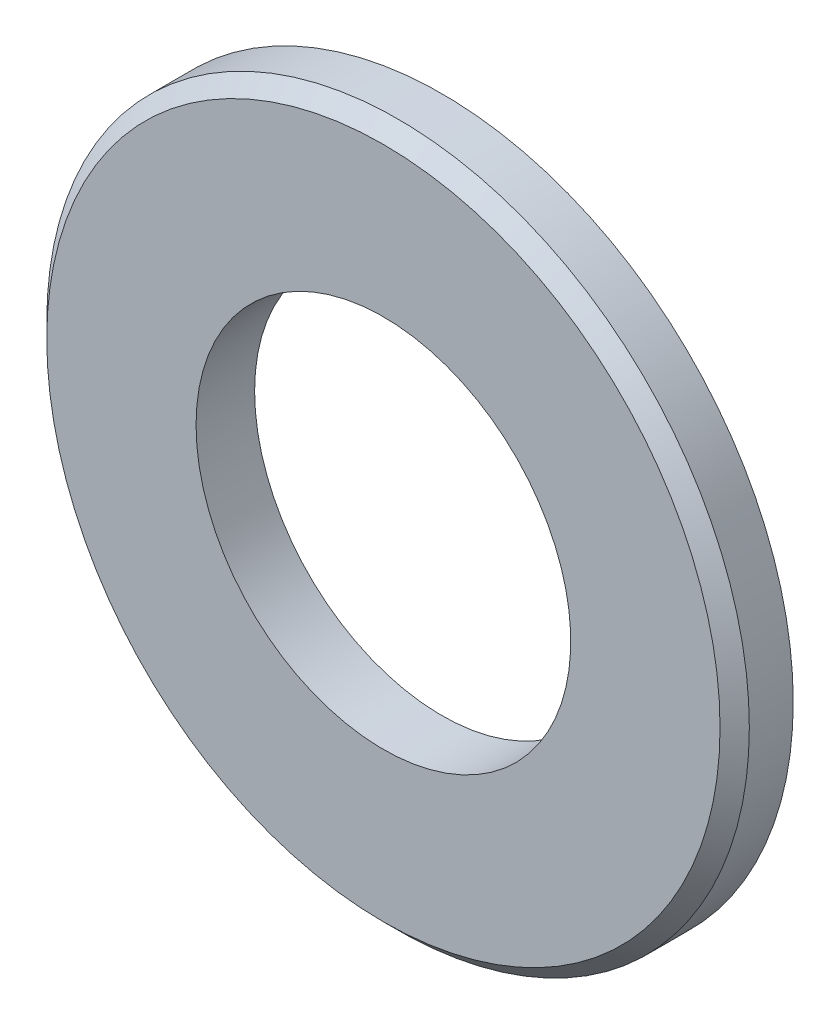
ISO-10303-21;
HEADER;
FILE_DESCRIPTION(('STEP AP214'),'2;1');
FILE_NAME('part.step','',(''),(''),'','','');
FILE_SCHEMA(('AUTOMOTIVE_DESIGN { 1 0 10303 214 1 1 1 1 }'));
ENDSEC;
DATA;
#1=APPLICATION_CONTEXT('core data for automotive mechanical design processes');
#2=APPLICATION_PROTOCOL_DEFINITION('international standard','automotive_design',2000,#1);
#3=PRODUCT_CONTEXT('',#1,'mechanical');
#4=PRODUCT('Part','Part','',(#3));
#5=PRODUCT_RELATED_PRODUCT_CATEGORY('part','',(#4));
#6=PRODUCT_DEFINITION_FORMATION('','',#4);
#7=PRODUCT_DEFINITION_CONTEXT('part definition',#1,'design');
#8=PRODUCT_DEFINITION('design','',#6,#7);
#9=PRODUCT_DEFINITION_SHAPE('','',#8);
#10=(LENGTH_UNIT() NAMED_UNIT(*) SI_UNIT(.MILLI.,.METRE.));
#11=(NAMED_UNIT(*) PLANE_ANGLE_UNIT() SI_UNIT($,.RADIAN.));
#12=(NAMED_UNIT(*) SI_UNIT($,.STERADIAN.) SOLID_ANGLE_UNIT());
#13=UNCERTAINTY_MEASURE_WITH_UNIT(LENGTH_MEASURE(1.E-05),#10,'distance_accuracy_value','');
#14=(GEOMETRIC_REPRESENTATION_CONTEXT(3) GLOBAL_UNCERTAINTY_ASSIGNED_CONTEXT((#13)) GLOBAL_UNIT_ASSIGNED_CONTEXT((#10,
#11,#12)) REPRESENTATION_CONTEXT('',''));
#15=CARTESIAN_POINT('',(0.,0.,0.));
#16=DIRECTION('',(0.,0.,1.));
#17=DIRECTION('',(1.,0.,0.));
#18=AXIS2_PLACEMENT_3D('',#15,#16,#17);
#19=CARTESIAN_POINT('',(2.2375,0.,0.25));
#20=DIRECTION('',(0.,0.,-1.));
#21=DIRECTION('',(-1.,0.,0.));
#22=AXIS2_PLACEMENT_3D('',#19,#20,#21);
#23=PLANE('',#22);
#24=CARTESIAN_POINT('',(0.,0.,0.25));
#25=DIRECTION('',(0.,0.,-1.));
#26=DIRECTION('',(-1.,0.,0.));
#27=AXIS2_PLACEMENT_3D('',#24,#25,#26);
#28=CIRCLE('',#27,2.875);
#29=CARTESIAN_POINT('',(-2.875,0.,0.25));
#30=VERTEX_POINT('',#29);
#31=EDGE_CURVE('E33',#30,#30,#28,.T.);
#32=ORIENTED_EDGE('',*,*,#31,.F.);
#33=EDGE_LOOP('',(#32));
#34=FACE_BOUND('',#33,.T.);
#35=CARTESIAN_POINT('',(0.,0.,0.25));
#36=DIRECTION('',(0.,0.,-1.));
#37=DIRECTION('',(-1.,0.,0.));
#38=AXIS2_PLACEMENT_3D('',#35,#36,#37);
#39=CIRCLE('',#38,1.6);
#40=CARTESIAN_POINT('',(-1.6,0.,0.25));
#41=VERTEX_POINT('',#40);
#42=EDGE_CURVE('E10',#41,#41,#39,.T.);
#43=ORIENTED_EDGE('',*,*,#42,.T.);
#44=EDGE_LOOP('',(#43));
#45=FACE_BOUND('',#44,.T.);
#46=ADVANCED_FACE('F14',(#34,#45),#23,.F.);
#47=CARTESIAN_POINT('',(0.,0.,2.85761549265734));
#48=DIRECTION('',(0.,0.,-1.));
#49=DIRECTION('',(-1.,0.,0.));
#50=AXIS2_PLACEMENT_3D('',#47,#48,#49);
#51=CYLINDRICAL_SURFACE('',#50,1.6);
#52=CARTESIAN_POINT('',(0.,0.,-0.25));
#53=DIRECTION('',(0.,0.,-1.));
#54=DIRECTION('',(-1.,0.,0.));
#55=AXIS2_PLACEMENT_3D('',#52,#53,#54);
#56=CIRCLE('',#55,1.6);
#57=CARTESIAN_POINT('',(-1.6,0.,-0.25));
#58=VERTEX_POINT('',#57);
#59=EDGE_CURVE('E20',#58,#58,#56,.T.);
#60=ORIENTED_EDGE('',*,*,#59,.T.);
#61=EDGE_LOOP('',(#60));
#62=FACE_BOUND('',#61,.T.);
#63=ORIENTED_EDGE('',*,*,#42,.F.);
#64=EDGE_LOOP('',(#63));
#65=FACE_BOUND('',#64,.T.);
#66=ADVANCED_FACE('F41',(#62,#65),#51,.F.);
#67=CARTESIAN_POINT('',(2.3,0.,-0.25));
#68=DIRECTION('',(0.,0.,-1.));
#69=DIRECTION('',(-1.,0.,0.));
#70=AXIS2_PLACEMENT_3D('',#67,#68,#69);
#71=PLANE('',#70);
#72=CARTESIAN_POINT('',(0.,0.,-0.25));
#73=DIRECTION('',(0.,0.,-1.));
#74=DIRECTION('',(-1.,0.,0.));
#75=AXIS2_PLACEMENT_3D('',#72,#73,#74);
#76=CIRCLE('',#75,3.);
#77=CARTESIAN_POINT('',(-3.,0.,-0.25));
#78=VERTEX_POINT('',#77);
#79=EDGE_CURVE('E24',#78,#78,#76,.T.);
#80=ORIENTED_EDGE('',*,*,#79,.T.);
#81=EDGE_LOOP('',(#80));
#82=FACE_BOUND('',#81,.T.);
#83=ORIENTED_EDGE('',*,*,#59,.F.);
#84=EDGE_LOOP('',(#83));
#85=FACE_BOUND('',#84,.T.);
#86=ADVANCED_FACE('F46',(#82,#85),#71,.T.);
#87=CARTESIAN_POINT('',(0.,0.,2.85761549265734));
#88=DIRECTION('',(0.,0.,-1.));
#89=DIRECTION('',(-1.,0.,0.));
#90=AXIS2_PLACEMENT_3D('',#87,#88,#89);
#91=CYLINDRICAL_SURFACE('',#90,3.);
#92=ORIENTED_EDGE('',*,*,#79,.F.);
#93=EDGE_LOOP('',(#92));
#94=FACE_BOUND('',#93,.T.);
#95=CARTESIAN_POINT('',(0.,0.,0.125));
#96=DIRECTION('',(0.,0.,-1.));
#97=DIRECTION('',(-1.,0.,0.));
#98=AXIS2_PLACEMENT_3D('',#95,#96,#97);
#99=CIRCLE('',#98,3.);
#100=CARTESIAN_POINT('',(-3.,0.,0.125));
#101=VERTEX_POINT('',#100);
#102=EDGE_CURVE('E28',#101,#101,#99,.T.);
#103=ORIENTED_EDGE('',*,*,#102,.T.);
#104=EDGE_LOOP('',(#103));
#105=FACE_BOUND('',#104,.T.);
#106=ADVANCED_FACE('F50',(#94,#105),#91,.T.);
#107=CARTESIAN_POINT('',(0.,0.,0.125));
#108=DIRECTION('',(0.,0.,-1.));
#109=DIRECTION('',(-1.,0.,0.));
#110=AXIS2_PLACEMENT_3D('',#107,#108,#109);
#111=CONICAL_SURFACE('',#110,3.,0.785398163397448);
#112=ORIENTED_EDGE('',*,*,#31,.T.);
#113=EDGE_LOOP('',(#112));
#114=FACE_BOUND('',#113,.T.);
#115=ORIENTED_EDGE('',*,*,#102,.F.);
#116=EDGE_LOOP('',(#115));
#117=FACE_BOUND('',#116,.T.);
#118=ADVANCED_FACE('F37',(#114,#117),#111,.T.);
#119=CLOSED_SHELL('',(#46,#66,#86,#106,#118));
#120=MANIFOLD_SOLID_BREP('B1',#119);
#121=ADVANCED_BREP_SHAPE_REPRESENTATION('',(#18,#120),#14);
#122=SHAPE_DEFINITION_REPRESENTATION(#9,#121);
ENDSEC;
END-ISO-10303-21;
